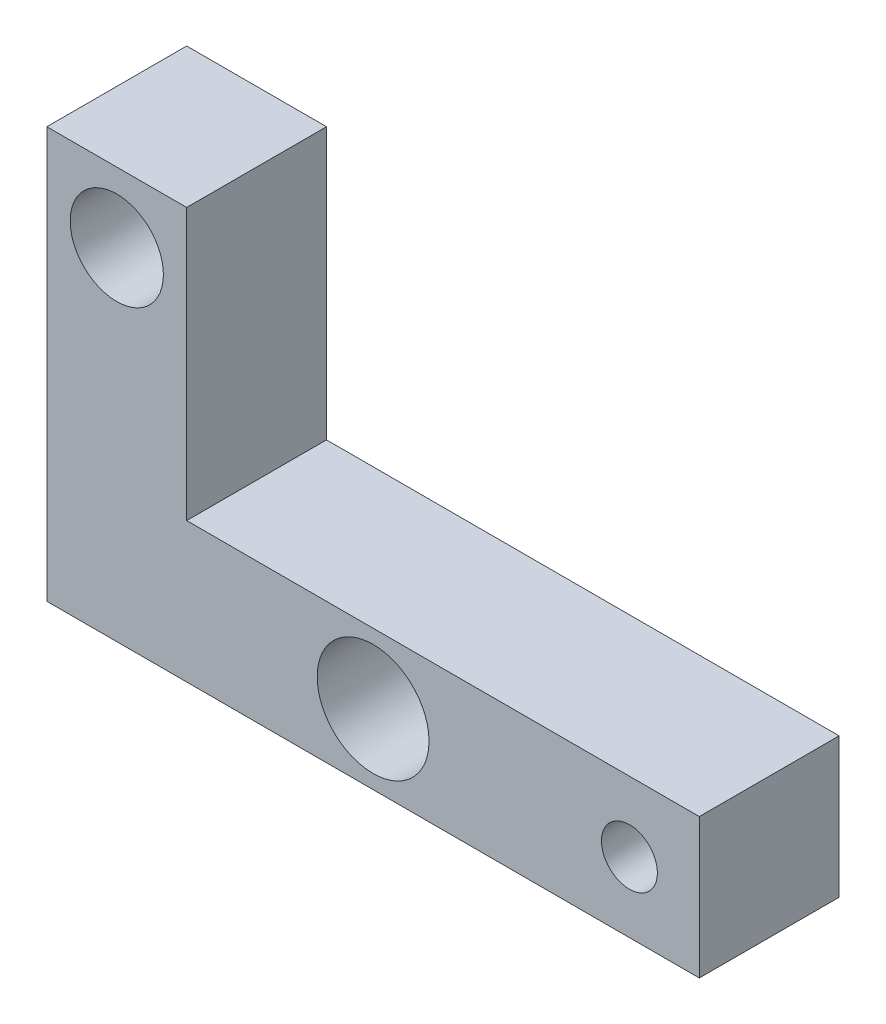
ISO-10303-21;
HEADER;
FILE_DESCRIPTION(('STEP AP214'),'2;1');
FILE_NAME('part.step','',(''),(''),'','','');
FILE_SCHEMA(('AUTOMOTIVE_DESIGN { 1 0 10303 214 1 1 1 1 }'));
ENDSEC;
DATA;
#1=APPLICATION_CONTEXT('core data for automotive mechanical design processes');
#2=APPLICATION_PROTOCOL_DEFINITION('international standard','automotive_design',2000,#1);
#3=PRODUCT_CONTEXT('',#1,'mechanical');
#4=PRODUCT('Part','Part','',(#3));
#5=PRODUCT_RELATED_PRODUCT_CATEGORY('part','',(#4));
#6=PRODUCT_DEFINITION_FORMATION('','',#4);
#7=PRODUCT_DEFINITION_CONTEXT('part definition',#1,'design');
#8=PRODUCT_DEFINITION('design','',#6,#7);
#9=PRODUCT_DEFINITION_SHAPE('','',#8);
#10=(LENGTH_UNIT() NAMED_UNIT(*) SI_UNIT(.MILLI.,.METRE.));
#11=(NAMED_UNIT(*) PLANE_ANGLE_UNIT() SI_UNIT($,.RADIAN.));
#12=(NAMED_UNIT(*) SI_UNIT($,.STERADIAN.) SOLID_ANGLE_UNIT());
#13=UNCERTAINTY_MEASURE_WITH_UNIT(LENGTH_MEASURE(1.E-05),#10,'distance_accuracy_value','');
#14=(GEOMETRIC_REPRESENTATION_CONTEXT(3) GLOBAL_UNCERTAINTY_ASSIGNED_CONTEXT((#13)) GLOBAL_UNIT_ASSIGNED_CONTEXT((#10,
#11,#12)) REPRESENTATION_CONTEXT('',''));
#15=CARTESIAN_POINT('',(0.,0.,0.));
#16=DIRECTION('',(0.,0.,1.));
#17=DIRECTION('',(1.,0.,0.));
#18=AXIS2_PLACEMENT_3D('',#15,#16,#17);
#19=CARTESIAN_POINT('',(0.,0.,15.));
#20=DIRECTION('',(0.,0.,-1.));
#21=DIRECTION('',(-1.,0.,0.));
#22=AXIS2_PLACEMENT_3D('',#19,#20,#21);
#23=PLANE('',#22);
#24=DIRECTION('',(1.,0.,0.));
#25=VECTOR('',#24,1.);
#26=CARTESIAN_POINT('',(70.,0.,15.));
#27=LINE('',#26,#25);
#28=CARTESIAN_POINT('',(0.,0.,15.));
#29=VERTEX_POINT('',#28);
#30=CARTESIAN_POINT('',(70.,0.,15.));
#31=VERTEX_POINT('',#30);
#32=EDGE_CURVE('E128',#29,#31,#27,.T.);
#33=ORIENTED_EDGE('',*,*,#32,.T.);
#34=DIRECTION('',(0.,1.,0.));
#35=VECTOR('',#34,1.);
#36=CARTESIAN_POINT('',(70.,15.,15.));
#37=LINE('',#36,#35);
#38=CARTESIAN_POINT('',(70.,15.,15.));
#39=VERTEX_POINT('',#38);
#40=EDGE_CURVE('E86',#31,#39,#37,.T.);
#41=ORIENTED_EDGE('',*,*,#40,.T.);
#42=DIRECTION('',(-1.,0.,0.));
#43=VECTOR('',#42,1.);
#44=CARTESIAN_POINT('',(15.,15.,15.));
#45=LINE('',#44,#43);
#46=CARTESIAN_POINT('',(15.,15.,15.));
#47=VERTEX_POINT('',#46);
#48=EDGE_CURVE('E99',#39,#47,#45,.T.);
#49=ORIENTED_EDGE('',*,*,#48,.T.);
#50=DIRECTION('',(0.,1.,0.));
#51=VECTOR('',#50,1.);
#52=CARTESIAN_POINT('',(15.,44.0962227129948,15.));
#53=LINE('',#52,#51);
#54=CARTESIAN_POINT('',(15.,44.0962227129948,15.));
#55=VERTEX_POINT('',#54);
#56=EDGE_CURVE('E93',#47,#55,#53,.T.);
#57=ORIENTED_EDGE('',*,*,#56,.T.);
#58=DIRECTION('',(-1.,0.,0.));
#59=VECTOR('',#58,1.);
#60=CARTESIAN_POINT('',(0.,44.0962227129948,15.));
#61=LINE('',#60,#59);
#62=CARTESIAN_POINT('',(0.,44.0962227129948,15.));
#63=VERTEX_POINT('',#62);
#64=EDGE_CURVE('E97',#55,#63,#61,.T.);
#65=ORIENTED_EDGE('',*,*,#64,.T.);
#66=DIRECTION('',(0.,-1.,0.));
#67=VECTOR('',#66,1.);
#68=CARTESIAN_POINT('',(0.,0.,15.));
#69=LINE('',#68,#67);
#70=EDGE_CURVE('E49',#63,#29,#69,.T.);
#71=ORIENTED_EDGE('',*,*,#70,.T.);
#72=EDGE_LOOP('',(#33,#41,#49,#57,#65,#71));
#73=FACE_BOUND('',#72,.T.);
#74=CARTESIAN_POINT('',(7.49999999999997,36.5962227129948,15.));
#75=DIRECTION('',(0.,0.,1.));
#76=DIRECTION('',(1.,0.,0.));
#77=AXIS2_PLACEMENT_3D('',#74,#75,#76);
#78=CIRCLE('',#77,5.);
#79=CARTESIAN_POINT('',(12.5,36.5962227129948,15.));
#80=VERTEX_POINT('',#79);
#81=EDGE_CURVE('E121',#80,#80,#78,.T.);
#82=ORIENTED_EDGE('',*,*,#81,.F.);
#83=EDGE_LOOP('',(#82));
#84=FACE_BOUND('',#83,.T.);
#85=CARTESIAN_POINT('',(62.5,7.5,15.));
#86=DIRECTION('',(0.,0.,1.));
#87=DIRECTION('',(1.,0.,0.));
#88=AXIS2_PLACEMENT_3D('',#85,#86,#87);
#89=CIRCLE('',#88,3.00000000000001);
#90=CARTESIAN_POINT('',(65.5,7.5,15.));
#91=VERTEX_POINT('',#90);
#92=EDGE_CURVE('E182',#91,#91,#89,.T.);
#93=ORIENTED_EDGE('',*,*,#92,.F.);
#94=EDGE_LOOP('',(#93));
#95=FACE_BOUND('',#94,.T.);
#96=CARTESIAN_POINT('',(35.,7.49999999999999,15.));
#97=DIRECTION('',(0.,0.,1.));
#98=DIRECTION('',(1.,0.,0.));
#99=AXIS2_PLACEMENT_3D('',#96,#97,#98);
#100=CIRCLE('',#99,5.99999999999999);
#101=CARTESIAN_POINT('',(41.,7.49999999999999,15.));
#102=VERTEX_POINT('',#101);
#103=EDGE_CURVE('E173',#102,#102,#100,.T.);
#104=ORIENTED_EDGE('',*,*,#103,.F.);
#105=EDGE_LOOP('',(#104));
#106=FACE_BOUND('',#105,.T.);
#107=ADVANCED_FACE('F32',(#73,#84,#95,#106),#23,.F.);
#108=CARTESIAN_POINT('',(0.,0.,0.));
#109=DIRECTION('',(0.,0.,-1.));
#110=DIRECTION('',(-1.,0.,0.));
#111=AXIS2_PLACEMENT_3D('',#108,#109,#110);
#112=PLANE('',#111);
#113=CARTESIAN_POINT('',(62.5,7.5,0.));
#114=DIRECTION('',(0.,0.,1.));
#115=DIRECTION('',(1.,0.,0.));
#116=AXIS2_PLACEMENT_3D('',#113,#114,#115);
#117=CIRCLE('',#116,3.00000000000001);
#118=CARTESIAN_POINT('',(65.5,7.5,0.));
#119=VERTEX_POINT('',#118);
#120=EDGE_CURVE('E179',#119,#119,#117,.T.);
#121=ORIENTED_EDGE('',*,*,#120,.T.);
#122=EDGE_LOOP('',(#121));
#123=FACE_BOUND('',#122,.T.);
#124=DIRECTION('',(1.,0.,0.));
#125=VECTOR('',#124,1.);
#126=CARTESIAN_POINT('',(70.,0.,0.));
#127=LINE('',#126,#125);
#128=CARTESIAN_POINT('',(0.,0.,0.));
#129=VERTEX_POINT('',#128);
#130=CARTESIAN_POINT('',(70.,0.,0.));
#131=VERTEX_POINT('',#130);
#132=EDGE_CURVE('E117',#129,#131,#127,.T.);
#133=ORIENTED_EDGE('',*,*,#132,.F.);
#134=DIRECTION('',(0.,-1.,0.));
#135=VECTOR('',#134,1.);
#136=CARTESIAN_POINT('',(0.,0.,0.));
#137=LINE('',#136,#135);
#138=CARTESIAN_POINT('',(0.,44.0962227129948,0.));
#139=VERTEX_POINT('',#138);
#140=EDGE_CURVE('E78',#139,#129,#137,.T.);
#141=ORIENTED_EDGE('',*,*,#140,.F.);
#142=DIRECTION('',(-1.,0.,0.));
#143=VECTOR('',#142,1.);
#144=CARTESIAN_POINT('',(0.,44.0962227129948,0.));
#145=LINE('',#144,#143);
#146=CARTESIAN_POINT('',(15.,44.0962227129948,0.));
#147=VERTEX_POINT('',#146);
#148=EDGE_CURVE('E72',#147,#139,#145,.T.);
#149=ORIENTED_EDGE('',*,*,#148,.F.);
#150=DIRECTION('',(0.,1.,0.));
#151=VECTOR('',#150,1.);
#152=CARTESIAN_POINT('',(15.,44.0962227129948,0.));
#153=LINE('',#152,#151);
#154=CARTESIAN_POINT('',(15.,15.,0.));
#155=VERTEX_POINT('',#154);
#156=EDGE_CURVE('E107',#155,#147,#153,.T.);
#157=ORIENTED_EDGE('',*,*,#156,.F.);
#158=DIRECTION('',(-1.,0.,0.));
#159=VECTOR('',#158,1.);
#160=CARTESIAN_POINT('',(15.,15.,0.));
#161=LINE('',#160,#159);
#162=CARTESIAN_POINT('',(70.,15.,0.));
#163=VERTEX_POINT('',#162);
#164=EDGE_CURVE('E123',#163,#155,#161,.T.);
#165=ORIENTED_EDGE('',*,*,#164,.F.);
#166=DIRECTION('',(0.,1.,0.));
#167=VECTOR('',#166,1.);
#168=CARTESIAN_POINT('',(70.,15.,0.));
#169=LINE('',#168,#167);
#170=EDGE_CURVE('E120',#131,#163,#169,.T.);
#171=ORIENTED_EDGE('',*,*,#170,.F.);
#172=EDGE_LOOP('',(#133,#141,#149,#157,#165,#171));
#173=FACE_BOUND('',#172,.T.);
#174=CARTESIAN_POINT('',(7.49999999999997,36.5962227129948,0.));
#175=DIRECTION('',(0.,0.,1.));
#176=DIRECTION('',(1.,0.,0.));
#177=AXIS2_PLACEMENT_3D('',#174,#175,#176);
#178=CIRCLE('',#177,5.);
#179=CARTESIAN_POINT('',(12.5,36.5962227129948,0.));
#180=VERTEX_POINT('',#179);
#181=EDGE_CURVE('E185',#180,#180,#178,.T.);
#182=ORIENTED_EDGE('',*,*,#181,.T.);
#183=EDGE_LOOP('',(#182));
#184=FACE_BOUND('',#183,.T.);
#185=CARTESIAN_POINT('',(35.,7.49999999999999,0.));
#186=DIRECTION('',(0.,0.,1.));
#187=DIRECTION('',(1.,0.,0.));
#188=AXIS2_PLACEMENT_3D('',#185,#186,#187);
#189=CIRCLE('',#188,5.99999999999999);
#190=CARTESIAN_POINT('',(41.,7.49999999999999,0.));
#191=VERTEX_POINT('',#190);
#192=EDGE_CURVE('E176',#191,#191,#189,.T.);
#193=ORIENTED_EDGE('',*,*,#192,.T.);
#194=EDGE_LOOP('',(#193));
#195=FACE_BOUND('',#194,.T.);
#196=ADVANCED_FACE('F137',(#123,#173,#184,#195),#112,.T.);
#197=CARTESIAN_POINT('',(70.,0.,15.));
#198=DIRECTION('',(0.,1.,0.));
#199=DIRECTION('',(-1.,0.,0.));
#200=AXIS2_PLACEMENT_3D('',#197,#198,#199);
#201=PLANE('',#200);
#202=ORIENTED_EDGE('',*,*,#132,.T.);
#203=DIRECTION('',(0.,0.,-1.));
#204=VECTOR('',#203,1.);
#205=CARTESIAN_POINT('',(70.,0.,15.));
#206=LINE('',#205,#204);
#207=EDGE_CURVE('E11',#31,#131,#206,.T.);
#208=ORIENTED_EDGE('',*,*,#207,.F.);
#209=ORIENTED_EDGE('',*,*,#32,.F.);
#210=DIRECTION('',(0.,0.,-1.));
#211=VECTOR('',#210,1.);
#212=CARTESIAN_POINT('',(0.,0.,15.));
#213=LINE('',#212,#211);
#214=EDGE_CURVE('E113',#29,#129,#213,.T.);
#215=ORIENTED_EDGE('',*,*,#214,.T.);
#216=EDGE_LOOP('',(#202,#208,#209,#215));
#217=FACE_BOUND('',#216,.T.);
#218=ADVANCED_FACE('F34',(#217),#201,.F.);
#219=CARTESIAN_POINT('',(70.,15.,15.));
#220=DIRECTION('',(-1.,0.,0.));
#221=DIRECTION('',(0.,0.,1.));
#222=AXIS2_PLACEMENT_3D('',#219,#220,#221);
#223=PLANE('',#222);
#224=ORIENTED_EDGE('',*,*,#170,.T.);
#225=DIRECTION('',(0.,0.,-1.));
#226=VECTOR('',#225,1.);
#227=CARTESIAN_POINT('',(70.,15.,15.));
#228=LINE('',#227,#226);
#229=EDGE_CURVE('E41',#39,#163,#228,.T.);
#230=ORIENTED_EDGE('',*,*,#229,.F.);
#231=ORIENTED_EDGE('',*,*,#40,.F.);
#232=ORIENTED_EDGE('',*,*,#207,.T.);
#233=EDGE_LOOP('',(#224,#230,#231,#232));
#234=FACE_BOUND('',#233,.T.);
#235=ADVANCED_FACE('F236',(#234),#223,.F.);
#236=CARTESIAN_POINT('',(15.,15.,15.));
#237=DIRECTION('',(0.,-1.,0.));
#238=DIRECTION('',(1.,0.,0.));
#239=AXIS2_PLACEMENT_3D('',#236,#237,#238);
#240=PLANE('',#239);
#241=ORIENTED_EDGE('',*,*,#164,.T.);
#242=DIRECTION('',(0.,0.,-1.));
#243=VECTOR('',#242,1.);
#244=CARTESIAN_POINT('',(15.,15.,15.));
#245=LINE('',#244,#243);
#246=EDGE_CURVE('E108',#47,#155,#245,.T.);
#247=ORIENTED_EDGE('',*,*,#246,.F.);
#248=ORIENTED_EDGE('',*,*,#48,.F.);
#249=ORIENTED_EDGE('',*,*,#229,.T.);
#250=EDGE_LOOP('',(#241,#247,#248,#249));
#251=FACE_BOUND('',#250,.T.);
#252=ADVANCED_FACE('F134',(#251),#240,.F.);
#253=CARTESIAN_POINT('',(15.,44.0962227129948,15.));
#254=DIRECTION('',(-1.,0.,0.));
#255=DIRECTION('',(0.,-1.,0.));
#256=AXIS2_PLACEMENT_3D('',#253,#254,#255);
#257=PLANE('',#256);
#258=ORIENTED_EDGE('',*,*,#156,.T.);
#259=DIRECTION('',(0.,0.,-1.));
#260=VECTOR('',#259,1.);
#261=CARTESIAN_POINT('',(15.,44.0962227129948,15.));
#262=LINE('',#261,#260);
#263=EDGE_CURVE('E104',#55,#147,#262,.T.);
#264=ORIENTED_EDGE('',*,*,#263,.F.);
#265=ORIENTED_EDGE('',*,*,#56,.F.);
#266=ORIENTED_EDGE('',*,*,#246,.T.);
#267=EDGE_LOOP('',(#258,#264,#265,#266));
#268=FACE_BOUND('',#267,.T.);
#269=ADVANCED_FACE('F105',(#268),#257,.F.);
#270=CARTESIAN_POINT('',(0.,44.0962227129948,15.));
#271=DIRECTION('',(0.,-1.,0.));
#272=DIRECTION('',(1.,0.,0.));
#273=AXIS2_PLACEMENT_3D('',#270,#271,#272);
#274=PLANE('',#273);
#275=ORIENTED_EDGE('',*,*,#148,.T.);
#276=DIRECTION('',(0.,0.,-1.));
#277=VECTOR('',#276,1.);
#278=CARTESIAN_POINT('',(0.,44.0962227129948,15.));
#279=LINE('',#278,#277);
#280=EDGE_CURVE('E109',#63,#139,#279,.T.);
#281=ORIENTED_EDGE('',*,*,#280,.F.);
#282=ORIENTED_EDGE('',*,*,#64,.F.);
#283=ORIENTED_EDGE('',*,*,#263,.T.);
#284=EDGE_LOOP('',(#275,#281,#282,#283));
#285=FACE_BOUND('',#284,.T.);
#286=ADVANCED_FACE('F111',(#285),#274,.F.);
#287=CARTESIAN_POINT('',(0.,0.,15.));
#288=DIRECTION('',(1.,0.,0.));
#289=DIRECTION('',(0.,1.,0.));
#290=AXIS2_PLACEMENT_3D('',#287,#288,#289);
#291=PLANE('',#290);
#292=ORIENTED_EDGE('',*,*,#140,.T.);
#293=ORIENTED_EDGE('',*,*,#214,.F.);
#294=ORIENTED_EDGE('',*,*,#70,.F.);
#295=ORIENTED_EDGE('',*,*,#280,.T.);
#296=EDGE_LOOP('',(#292,#293,#294,#295));
#297=FACE_BOUND('',#296,.T.);
#298=ADVANCED_FACE('F142',(#297),#291,.F.);
#299=CARTESIAN_POINT('',(7.49999999999997,36.5962227129948,15.));
#300=DIRECTION('',(0.,0.,-1.));
#301=DIRECTION('',(-1.,0.,0.));
#302=AXIS2_PLACEMENT_3D('',#299,#300,#301);
#303=CYLINDRICAL_SURFACE('',#302,5.);
#304=ORIENTED_EDGE('',*,*,#81,.T.);
#305=EDGE_LOOP('',(#304));
#306=FACE_BOUND('',#305,.T.);
#307=ORIENTED_EDGE('',*,*,#181,.F.);
#308=EDGE_LOOP('',(#307));
#309=FACE_BOUND('',#308,.T.);
#310=ADVANCED_FACE('F144',(#306,#309),#303,.F.);
#311=CARTESIAN_POINT('',(62.5,7.5,15.));
#312=DIRECTION('',(0.,0.,-1.));
#313=DIRECTION('',(-1.,0.,0.));
#314=AXIS2_PLACEMENT_3D('',#311,#312,#313);
#315=CYLINDRICAL_SURFACE('',#314,3.00000000000001);
#316=ORIENTED_EDGE('',*,*,#92,.T.);
#317=EDGE_LOOP('',(#316));
#318=FACE_BOUND('',#317,.T.);
#319=ORIENTED_EDGE('',*,*,#120,.F.);
#320=EDGE_LOOP('',(#319));
#321=FACE_BOUND('',#320,.T.);
#322=ADVANCED_FACE('F150',(#318,#321),#315,.F.);
#323=CARTESIAN_POINT('',(35.,7.49999999999999,15.));
#324=DIRECTION('',(0.,0.,-1.));
#325=DIRECTION('',(-1.,0.,0.));
#326=AXIS2_PLACEMENT_3D('',#323,#324,#325);
#327=CYLINDRICAL_SURFACE('',#326,5.99999999999999);
#328=ORIENTED_EDGE('',*,*,#103,.T.);
#329=EDGE_LOOP('',(#328));
#330=FACE_BOUND('',#329,.T.);
#331=ORIENTED_EDGE('',*,*,#192,.F.);
#332=EDGE_LOOP('',(#331));
#333=FACE_BOUND('',#332,.T.);
#334=ADVANCED_FACE('F164',(#330,#333),#327,.F.);
#335=CLOSED_SHELL('',(#107,#196,#218,#235,#252,#269,#286,#298,#310,#322,#334));
#336=MANIFOLD_SOLID_BREP('B2',#335);
#337=ADVANCED_BREP_SHAPE_REPRESENTATION('',(#18,#336),#14);
#338=SHAPE_DEFINITION_REPRESENTATION(#9,#337);
ENDSEC;
END-ISO-10303-21;
